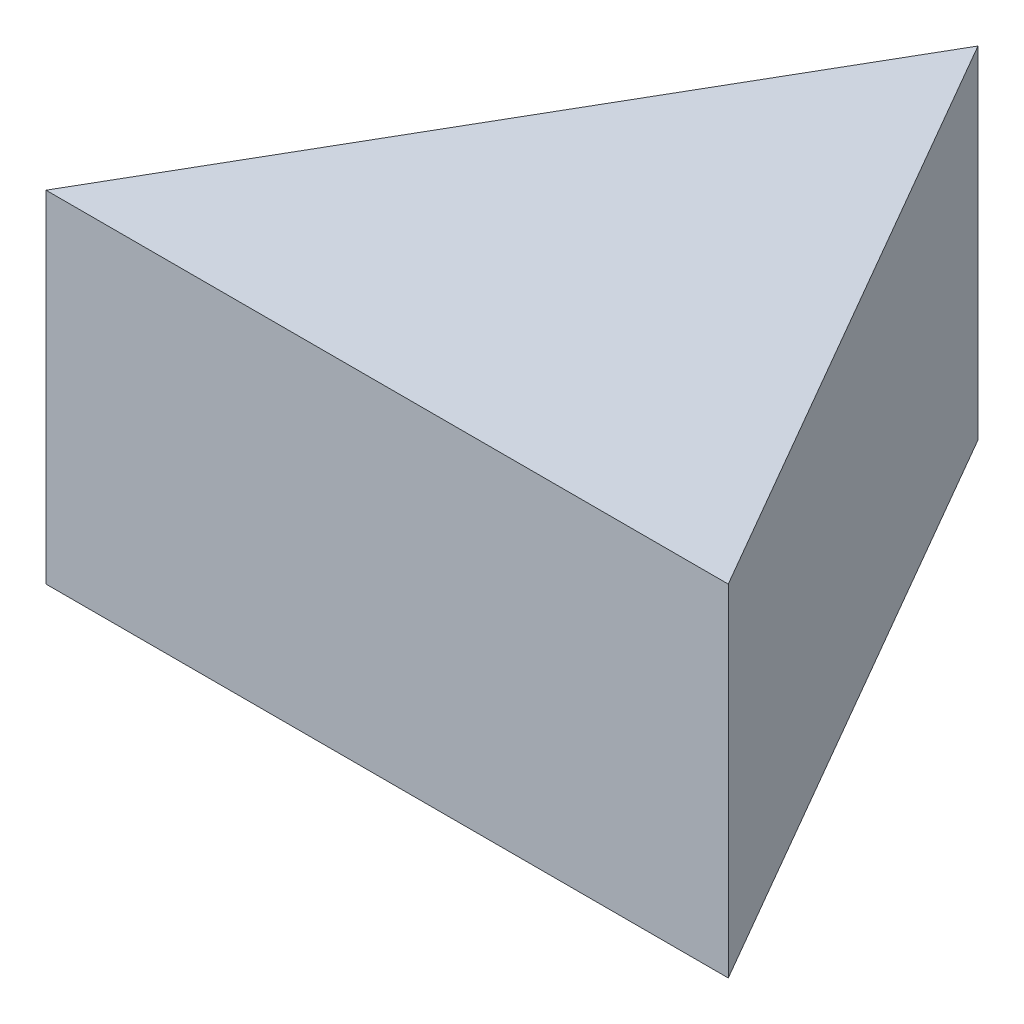
ISO-10303-21;
HEADER;
FILE_DESCRIPTION(('STEP AP214'),'2;1');
FILE_NAME('part.step','',(''),(''),'','','');
FILE_SCHEMA(('AUTOMOTIVE_DESIGN { 1 0 10303 214 1 1 1 1 }'));
ENDSEC;
DATA;
#1=APPLICATION_CONTEXT('core data for automotive mechanical design processes');
#2=APPLICATION_PROTOCOL_DEFINITION('international standard','automotive_design',2000,#1);
#3=PRODUCT_CONTEXT('',#1,'mechanical');
#4=PRODUCT('Part','Part','',(#3));
#5=PRODUCT_RELATED_PRODUCT_CATEGORY('part','',(#4));
#6=PRODUCT_DEFINITION_FORMATION('','',#4);
#7=PRODUCT_DEFINITION_CONTEXT('part definition',#1,'design');
#8=PRODUCT_DEFINITION('design','',#6,#7);
#9=PRODUCT_DEFINITION_SHAPE('','',#8);
#10=(LENGTH_UNIT() NAMED_UNIT(*) SI_UNIT(.MILLI.,.METRE.));
#11=(NAMED_UNIT(*) PLANE_ANGLE_UNIT() SI_UNIT($,.RADIAN.));
#12=(NAMED_UNIT(*) SI_UNIT($,.STERADIAN.) SOLID_ANGLE_UNIT());
#13=UNCERTAINTY_MEASURE_WITH_UNIT(LENGTH_MEASURE(1.E-05),#10,'distance_accuracy_value','');
#14=(GEOMETRIC_REPRESENTATION_CONTEXT(3) GLOBAL_UNCERTAINTY_ASSIGNED_CONTEXT((#13)) GLOBAL_UNIT_ASSIGNED_CONTEXT((#10,
#11,#12)) REPRESENTATION_CONTEXT('',''));
#15=CARTESIAN_POINT('',(0.,0.,0.));
#16=DIRECTION('',(0.,0.,1.));
#17=DIRECTION('',(1.,0.,0.));
#18=AXIS2_PLACEMENT_3D('',#15,#16,#17);
#19=CARTESIAN_POINT('',(10.,5.,0.));
#20=DIRECTION('',(0.,0.,-1.));
#21=DIRECTION('',(-1.,0.,0.));
#22=AXIS2_PLACEMENT_3D('',#19,#20,#21);
#23=PLANE('',#22);
#24=DIRECTION('',(1.,0.,0.));
#25=VECTOR('',#24,1.);
#26=CARTESIAN_POINT('',(10.,0.,0.));
#27=LINE('',#26,#25);
#28=CARTESIAN_POINT('',(0.,0.,0.));
#29=VERTEX_POINT('',#28);
#30=CARTESIAN_POINT('',(10.,0.,0.));
#31=VERTEX_POINT('',#30);
#32=EDGE_CURVE('E83',#29,#31,#27,.T.);
#33=ORIENTED_EDGE('',*,*,#32,.T.);
#34=DIRECTION('',(0.,-1.,0.));
#35=VECTOR('',#34,1.);
#36=CARTESIAN_POINT('',(10.,5.,0.));
#37=LINE('',#36,#35);
#38=CARTESIAN_POINT('',(10.,5.,0.));
#39=VERTEX_POINT('',#38);
#40=EDGE_CURVE('E11',#39,#31,#37,.T.);
#41=ORIENTED_EDGE('',*,*,#40,.F.);
#42=DIRECTION('',(1.,0.,0.));
#43=VECTOR('',#42,1.);
#44=CARTESIAN_POINT('',(10.,5.,0.));
#45=LINE('',#44,#43);
#46=CARTESIAN_POINT('',(0.,5.,0.));
#47=VERTEX_POINT('',#46);
#48=EDGE_CURVE('E76',#47,#39,#45,.T.);
#49=ORIENTED_EDGE('',*,*,#48,.F.);
#50=DIRECTION('',(0.,-1.,0.));
#51=VECTOR('',#50,1.);
#52=CARTESIAN_POINT('',(0.,5.,0.));
#53=LINE('',#52,#51);
#54=EDGE_CURVE('E84',#47,#29,#53,.T.);
#55=ORIENTED_EDGE('',*,*,#54,.T.);
#56=EDGE_LOOP('',(#33,#41,#49,#55));
#57=FACE_BOUND('',#56,.T.);
#58=ADVANCED_FACE('F36',(#57),#23,.F.);
#59=CARTESIAN_POINT('',(5.,5.,-8.66025403784439));
#60=DIRECTION('',(-0.866025403784439,0.,0.5));
#61=DIRECTION('',(0.5,0.,0.866025403784439));
#62=AXIS2_PLACEMENT_3D('',#59,#60,#61);
#63=PLANE('',#62);
#64=DIRECTION('',(-0.5,0.,-0.866025403784439));
#65=VECTOR('',#64,1.);
#66=CARTESIAN_POINT('',(5.,0.,-8.66025403784439));
#67=LINE('',#66,#65);
#68=CARTESIAN_POINT('',(5.,0.,-8.66025403784439));
#69=VERTEX_POINT('',#68);
#70=EDGE_CURVE('E64',#31,#69,#67,.T.);
#71=ORIENTED_EDGE('',*,*,#70,.T.);
#72=DIRECTION('',(0.,-1.,0.));
#73=VECTOR('',#72,1.);
#74=CARTESIAN_POINT('',(5.,5.,-8.66025403784439));
#75=LINE('',#74,#73);
#76=CARTESIAN_POINT('',(5.,5.,-8.66025403784439));
#77=VERTEX_POINT('',#76);
#78=EDGE_CURVE('E44',#77,#69,#75,.T.);
#79=ORIENTED_EDGE('',*,*,#78,.F.);
#80=DIRECTION('',(-0.5,0.,-0.866025403784439));
#81=VECTOR('',#80,1.);
#82=CARTESIAN_POINT('',(5.,5.,-8.66025403784439));
#83=LINE('',#82,#81);
#84=EDGE_CURVE('E72',#39,#77,#83,.T.);
#85=ORIENTED_EDGE('',*,*,#84,.F.);
#86=ORIENTED_EDGE('',*,*,#40,.T.);
#87=EDGE_LOOP('',(#71,#79,#85,#86));
#88=FACE_BOUND('',#87,.T.);
#89=ADVANCED_FACE('F73',(#88),#63,.F.);
#90=CARTESIAN_POINT('',(0.,5.,0.));
#91=DIRECTION('',(0.866025403784439,0.,0.5));
#92=DIRECTION('',(0.5,0.,-0.866025403784439));
#93=AXIS2_PLACEMENT_3D('',#90,#91,#92);
#94=PLANE('',#93);
#95=DIRECTION('',(-0.5,0.,0.866025403784439));
#96=VECTOR('',#95,1.);
#97=CARTESIAN_POINT('',(0.,0.,0.));
#98=LINE('',#97,#96);
#99=EDGE_CURVE('E69',#69,#29,#98,.T.);
#100=ORIENTED_EDGE('',*,*,#99,.T.);
#101=ORIENTED_EDGE('',*,*,#54,.F.);
#102=DIRECTION('',(-0.5,0.,0.866025403784439));
#103=VECTOR('',#102,1.);
#104=CARTESIAN_POINT('',(0.,5.,0.));
#105=LINE('',#104,#103);
#106=EDGE_CURVE('E52',#77,#47,#105,.T.);
#107=ORIENTED_EDGE('',*,*,#106,.F.);
#108=ORIENTED_EDGE('',*,*,#78,.T.);
#109=EDGE_LOOP('',(#100,#101,#107,#108));
#110=FACE_BOUND('',#109,.T.);
#111=ADVANCED_FACE('F91',(#110),#94,.F.);
#112=CARTESIAN_POINT('',(0.,5.,0.));
#113=DIRECTION('',(0.,-1.,0.));
#114=DIRECTION('',(0.,0.,-1.));
#115=AXIS2_PLACEMENT_3D('',#112,#113,#114);
#116=PLANE('',#115);
#117=ORIENTED_EDGE('',*,*,#48,.T.);
#118=ORIENTED_EDGE('',*,*,#84,.T.);
#119=ORIENTED_EDGE('',*,*,#106,.T.);
#120=EDGE_LOOP('',(#117,#118,#119));
#121=FACE_BOUND('',#120,.T.);
#122=ADVANCED_FACE('F79',(#121),#116,.F.);
#123=CARTESIAN_POINT('',(0.,0.,0.));
#124=DIRECTION('',(0.,-1.,0.));
#125=DIRECTION('',(0.,0.,-1.));
#126=AXIS2_PLACEMENT_3D('',#123,#124,#125);
#127=PLANE('',#126);
#128=ORIENTED_EDGE('',*,*,#32,.F.);
#129=ORIENTED_EDGE('',*,*,#99,.F.);
#130=ORIENTED_EDGE('',*,*,#70,.F.);
#131=EDGE_LOOP('',(#128,#129,#130));
#132=FACE_BOUND('',#131,.T.);
#133=ADVANCED_FACE('F92',(#132),#127,.T.);
#134=CLOSED_SHELL('',(#58,#89,#111,#122,#133));
#135=MANIFOLD_SOLID_BREP('B2',#134);
#136=ADVANCED_BREP_SHAPE_REPRESENTATION('',(#18,#135),#14);
#137=SHAPE_DEFINITION_REPRESENTATION(#9,#136);
ENDSEC;
END-ISO-10303-21;
